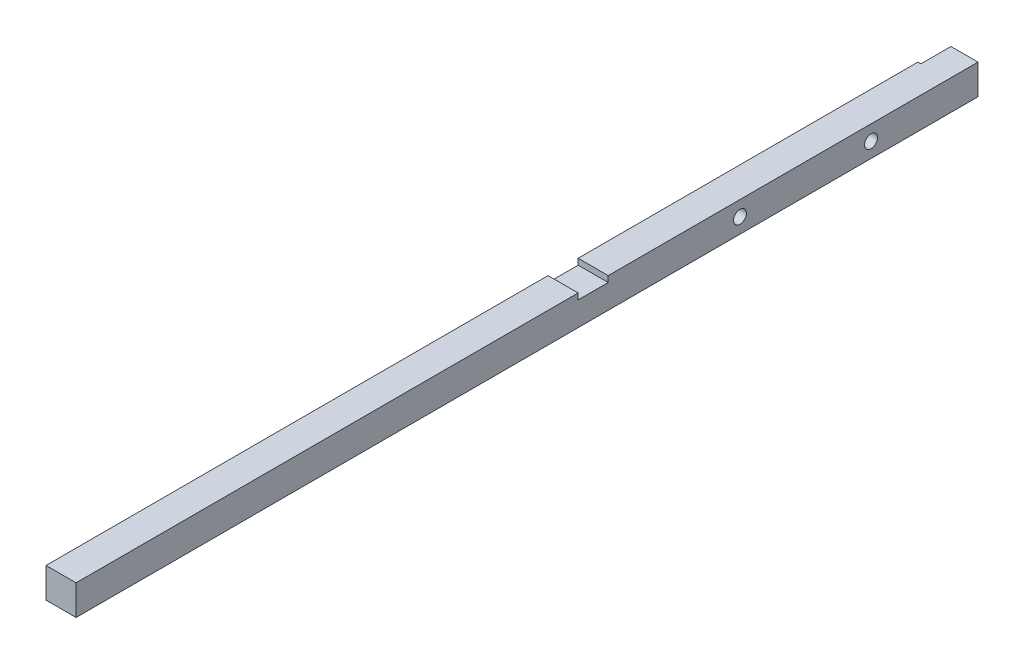
ISO-10303-21;
HEADER;
FILE_DESCRIPTION(('STEP AP214'),'2;1');
FILE_NAME('part.step','',(''),(''),'','','');
FILE_SCHEMA(('AUTOMOTIVE_DESIGN { 1 0 10303 214 1 1 1 1 }'));
ENDSEC;
DATA;
#1=APPLICATION_CONTEXT('core data for automotive mechanical design processes');
#2=APPLICATION_PROTOCOL_DEFINITION('international standard','automotive_design',2000,#1);
#3=PRODUCT_CONTEXT('',#1,'mechanical');
#4=PRODUCT('Part','Part','',(#3));
#5=PRODUCT_RELATED_PRODUCT_CATEGORY('part','',(#4));
#6=PRODUCT_DEFINITION_FORMATION('','',#4);
#7=PRODUCT_DEFINITION_CONTEXT('part definition',#1,'design');
#8=PRODUCT_DEFINITION('design','',#6,#7);
#9=PRODUCT_DEFINITION_SHAPE('','',#8);
#10=(LENGTH_UNIT() NAMED_UNIT(*) SI_UNIT(.MILLI.,.METRE.));
#11=(NAMED_UNIT(*) PLANE_ANGLE_UNIT() SI_UNIT($,.RADIAN.));
#12=(NAMED_UNIT(*) SI_UNIT($,.STERADIAN.) SOLID_ANGLE_UNIT());
#13=UNCERTAINTY_MEASURE_WITH_UNIT(LENGTH_MEASURE(1.E-05),#10,'distance_accuracy_value','');
#14=(GEOMETRIC_REPRESENTATION_CONTEXT(3) GLOBAL_UNCERTAINTY_ASSIGNED_CONTEXT((#13)) GLOBAL_UNIT_ASSIGNED_CONTEXT((#10,
#11,#12)) REPRESENTATION_CONTEXT('',''));
#15=CARTESIAN_POINT('',(0.,0.,0.));
#16=DIRECTION('',(0.,0.,1.));
#17=DIRECTION('',(1.,0.,0.));
#18=AXIS2_PLACEMENT_3D('',#15,#16,#17);
#19=CARTESIAN_POINT('',(-5.,5.,323.142135623731));
#20=DIRECTION('',(0.,-1.,0.));
#21=DIRECTION('',(0.,0.,-1.));
#22=AXIS2_PLACEMENT_3D('',#19,#20,#21);
#23=PLANE('',#22);
#24=DIRECTION('',(0.,0.,-1.));
#25=VECTOR('',#24,1.);
#26=CARTESIAN_POINT('',(5.,5.,323.142135623731));
#27=LINE('',#26,#25);
#28=CARTESIAN_POINT('',(5.,5.,307.));
#29=VERTEX_POINT('',#28);
#30=CARTESIAN_POINT('',(5.,5.,140.));
#31=VERTEX_POINT('',#30);
#32=EDGE_CURVE('E152',#29,#31,#27,.T.);
#33=ORIENTED_EDGE('',*,*,#32,.T.);
#34=DIRECTION('',(1.,0.,0.));
#35=VECTOR('',#34,1.);
#36=CARTESIAN_POINT('',(-5.,5.,140.));
#37=LINE('',#36,#35);
#38=CARTESIAN_POINT('',(-5.,5.,140.));
#39=VERTEX_POINT('',#38);
#40=EDGE_CURVE('E192',#39,#31,#37,.T.);
#41=ORIENTED_EDGE('',*,*,#40,.F.);
#42=DIRECTION('',(0.,0.,-1.));
#43=VECTOR('',#42,1.);
#44=CARTESIAN_POINT('',(-5.,5.,323.142135623731));
#45=LINE('',#44,#43);
#46=CARTESIAN_POINT('',(-5.,5.,307.));
#47=VERTEX_POINT('',#46);
#48=EDGE_CURVE('E38',#47,#39,#45,.T.);
#49=ORIENTED_EDGE('',*,*,#48,.F.);
#50=DIRECTION('',(-1.,0.,0.));
#51=VECTOR('',#50,1.);
#52=CARTESIAN_POINT('',(-5.,5.,307.));
#53=LINE('',#52,#51);
#54=EDGE_CURVE('E149',#29,#47,#53,.T.);
#55=ORIENTED_EDGE('',*,*,#54,.F.);
#56=EDGE_LOOP('',(#33,#41,#49,#55));
#57=FACE_BOUND('',#56,.T.);
#58=ADVANCED_FACE('F34',(#57),#23,.F.);
#59=CARTESIAN_POINT('',(-5.,5.,323.142135623731));
#60=DIRECTION('',(1.,0.,0.));
#61=DIRECTION('',(0.,1.,0.));
#62=AXIS2_PLACEMENT_3D('',#59,#60,#61);
#63=PLANE('',#62);
#64=CARTESIAN_POINT('',(-5.,0.,86.1864829275686));
#65=DIRECTION('',(-1.,0.,0.));
#66=DIRECTION('',(0.,0.,1.));
#67=AXIS2_PLACEMENT_3D('',#64,#65,#66);
#68=CIRCLE('',#67,2.14999999999999);
#69=CARTESIAN_POINT('',(-5.,0.,88.3364829275686));
#70=VERTEX_POINT('',#69);
#71=EDGE_CURVE('E256',#70,#70,#68,.T.);
#72=ORIENTED_EDGE('',*,*,#71,.F.);
#73=EDGE_LOOP('',(#72));
#74=FACE_BOUND('',#73,.T.);
#75=CARTESIAN_POINT('',(-5.,0.,42.5864829275686));
#76=DIRECTION('',(-1.,0.,0.));
#77=DIRECTION('',(0.,0.,1.));
#78=AXIS2_PLACEMENT_3D('',#75,#76,#77);
#79=CIRCLE('',#78,2.14999999999999);
#80=CARTESIAN_POINT('',(-5.,0.,44.7364829275686));
#81=VERTEX_POINT('',#80);
#82=EDGE_CURVE('E250',#81,#81,#79,.T.);
#83=ORIENTED_EDGE('',*,*,#82,.F.);
#84=EDGE_LOOP('',(#83));
#85=FACE_BOUND('',#84,.T.);
#86=CARTESIAN_POINT('',(-5.,5.,130.));
#87=VERTEX_POINT('',#86);
#88=CARTESIAN_POINT('',(-5.,4.99999999999999,17.));
#89=VERTEX_POINT('',#88);
#90=EDGE_CURVE('E194',#87,#89,#45,.T.);
#91=ORIENTED_EDGE('',*,*,#90,.T.);
#92=DIRECTION('',(0.,1.,0.));
#93=VECTOR('',#92,1.);
#94=CARTESIAN_POINT('',(-5.,-5.,17.));
#95=LINE('',#94,#93);
#96=CARTESIAN_POINT('',(-5.,-5.,17.));
#97=VERTEX_POINT('',#96);
#98=EDGE_CURVE('E121',#97,#89,#95,.T.);
#99=ORIENTED_EDGE('',*,*,#98,.F.);
#100=DIRECTION('',(0.,0.,-1.));
#101=VECTOR('',#100,1.);
#102=CARTESIAN_POINT('',(-5.,-5.,323.142135623731));
#103=LINE('',#102,#101);
#104=CARTESIAN_POINT('',(-5.,-5.,307.));
#105=VERTEX_POINT('',#104);
#106=EDGE_CURVE('E137',#105,#97,#103,.T.);
#107=ORIENTED_EDGE('',*,*,#106,.F.);
#108=DIRECTION('',(0.,-1.,0.));
#109=VECTOR('',#108,1.);
#110=CARTESIAN_POINT('',(-5.,5.,307.));
#111=LINE('',#110,#109);
#112=EDGE_CURVE('E146',#47,#105,#111,.T.);
#113=ORIENTED_EDGE('',*,*,#112,.F.);
#114=ORIENTED_EDGE('',*,*,#48,.T.);
#115=DIRECTION('',(0.,-1.,0.));
#116=VECTOR('',#115,1.);
#117=CARTESIAN_POINT('',(-5.,5.,140.));
#118=LINE('',#117,#116);
#119=CARTESIAN_POINT('',(-5.,3.,140.));
#120=VERTEX_POINT('',#119);
#121=EDGE_CURVE('E176',#39,#120,#118,.T.);
#122=ORIENTED_EDGE('',*,*,#121,.T.);
#123=DIRECTION('',(0.,0.,-1.));
#124=VECTOR('',#123,1.);
#125=CARTESIAN_POINT('',(-5.,3.,140.));
#126=LINE('',#125,#124);
#127=CARTESIAN_POINT('',(-5.,3.,130.));
#128=VERTEX_POINT('',#127);
#129=EDGE_CURVE('E179',#120,#128,#126,.T.);
#130=ORIENTED_EDGE('',*,*,#129,.T.);
#131=DIRECTION('',(0.,1.,0.));
#132=VECTOR('',#131,1.);
#133=CARTESIAN_POINT('',(-5.,5.,130.));
#134=LINE('',#133,#132);
#135=EDGE_CURVE('E182',#128,#87,#134,.T.);
#136=ORIENTED_EDGE('',*,*,#135,.T.);
#137=EDGE_LOOP('',(#91,#99,#107,#113,#114,#122,#130,#136));
#138=FACE_BOUND('',#137,.T.);
#139=ADVANCED_FACE('F211',(#74,#85,#138),#63,.F.);
#140=CARTESIAN_POINT('',(-5.,-5.,323.142135623731));
#141=DIRECTION('',(0.,1.,0.));
#142=DIRECTION('',(0.,0.,1.));
#143=AXIS2_PLACEMENT_3D('',#140,#141,#142);
#144=PLANE('',#143);
#145=ORIENTED_EDGE('',*,*,#106,.T.);
#146=DIRECTION('',(-1.,0.,0.));
#147=VECTOR('',#146,1.);
#148=CARTESIAN_POINT('',(-4.,-5.,17.));
#149=LINE('',#148,#147);
#150=CARTESIAN_POINT('',(-4.,-5.,17.));
#151=VERTEX_POINT('',#150);
#152=EDGE_CURVE('E129',#151,#97,#149,.T.);
#153=ORIENTED_EDGE('',*,*,#152,.F.);
#154=DIRECTION('',(0.,0.,1.));
#155=VECTOR('',#154,1.);
#156=CARTESIAN_POINT('',(-4.,-5.,7.));
#157=LINE('',#156,#155);
#158=CARTESIAN_POINT('',(-4.,-5.,7.));
#159=VERTEX_POINT('',#158);
#160=EDGE_CURVE('E115',#159,#151,#157,.T.);
#161=ORIENTED_EDGE('',*,*,#160,.F.);
#162=DIRECTION('',(1.,0.,0.));
#163=VECTOR('',#162,1.);
#164=CARTESIAN_POINT('',(-5.,-5.,7.));
#165=LINE('',#164,#163);
#166=CARTESIAN_POINT('',(5.,-5.,7.));
#167=VERTEX_POINT('',#166);
#168=EDGE_CURVE('E127',#159,#167,#165,.T.);
#169=ORIENTED_EDGE('',*,*,#168,.T.);
#170=DIRECTION('',(0.,0.,-1.));
#171=VECTOR('',#170,1.);
#172=CARTESIAN_POINT('',(5.,-5.,323.142135623731));
#173=LINE('',#172,#171);
#174=CARTESIAN_POINT('',(5.,-5.,307.));
#175=VERTEX_POINT('',#174);
#176=EDGE_CURVE('E136',#175,#167,#173,.T.);
#177=ORIENTED_EDGE('',*,*,#176,.F.);
#178=DIRECTION('',(1.,0.,0.));
#179=VECTOR('',#178,1.);
#180=CARTESIAN_POINT('',(-5.,-5.,307.));
#181=LINE('',#180,#179);
#182=EDGE_CURVE('E43',#105,#175,#181,.T.);
#183=ORIENTED_EDGE('',*,*,#182,.F.);
#184=EDGE_LOOP('',(#145,#153,#161,#169,#177,#183));
#185=FACE_BOUND('',#184,.T.);
#186=ADVANCED_FACE('F125',(#185),#144,.F.);
#187=CARTESIAN_POINT('',(5.,5.,323.142135623731));
#188=DIRECTION('',(-1.,0.,0.));
#189=DIRECTION('',(0.,-1.,0.));
#190=AXIS2_PLACEMENT_3D('',#187,#188,#189);
#191=PLANE('',#190);
#192=CARTESIAN_POINT('',(5.,0.,86.1864829275686));
#193=DIRECTION('',(-1.,0.,0.));
#194=DIRECTION('',(0.,0.,1.));
#195=AXIS2_PLACEMENT_3D('',#192,#193,#194);
#196=CIRCLE('',#195,2.15);
#197=CARTESIAN_POINT('',(5.,0.,88.3364829275686));
#198=VERTEX_POINT('',#197);
#199=EDGE_CURVE('E246',#198,#198,#196,.T.);
#200=ORIENTED_EDGE('',*,*,#199,.T.);
#201=EDGE_LOOP('',(#200));
#202=FACE_BOUND('',#201,.T.);
#203=CARTESIAN_POINT('',(5.,0.,42.5864829275686));
#204=DIRECTION('',(-1.,0.,0.));
#205=DIRECTION('',(0.,0.,1.));
#206=AXIS2_PLACEMENT_3D('',#203,#204,#205);
#207=CIRCLE('',#206,2.15);
#208=CARTESIAN_POINT('',(5.,0.,44.7364829275686));
#209=VERTEX_POINT('',#208);
#210=EDGE_CURVE('E173',#209,#209,#207,.T.);
#211=ORIENTED_EDGE('',*,*,#210,.T.);
#212=EDGE_LOOP('',(#211));
#213=FACE_BOUND('',#212,.T.);
#214=DIRECTION('',(0.,0.,-1.));
#215=VECTOR('',#214,1.);
#216=CARTESIAN_POINT('',(5.,3.,140.));
#217=LINE('',#216,#215);
#218=CARTESIAN_POINT('',(5.,3.,140.));
#219=VERTEX_POINT('',#218);
#220=CARTESIAN_POINT('',(5.,3.,130.));
#221=VERTEX_POINT('',#220);
#222=EDGE_CURVE('E188',#219,#221,#217,.T.);
#223=ORIENTED_EDGE('',*,*,#222,.F.);
#224=DIRECTION('',(0.,-1.,0.));
#225=VECTOR('',#224,1.);
#226=CARTESIAN_POINT('',(5.,5.,140.));
#227=LINE('',#226,#225);
#228=EDGE_CURVE('E174',#31,#219,#227,.T.);
#229=ORIENTED_EDGE('',*,*,#228,.F.);
#230=ORIENTED_EDGE('',*,*,#32,.F.);
#231=DIRECTION('',(0.,1.,0.));
#232=VECTOR('',#231,1.);
#233=CARTESIAN_POINT('',(5.,5.,307.));
#234=LINE('',#233,#232);
#235=EDGE_CURVE('E12',#175,#29,#234,.T.);
#236=ORIENTED_EDGE('',*,*,#235,.F.);
#237=ORIENTED_EDGE('',*,*,#176,.T.);
#238=DIRECTION('',(0.,1.,0.));
#239=VECTOR('',#238,1.);
#240=CARTESIAN_POINT('',(5.,5.,7.));
#241=LINE('',#240,#239);
#242=CARTESIAN_POINT('',(5.,5.,7.));
#243=VERTEX_POINT('',#242);
#244=EDGE_CURVE('E135',#167,#243,#241,.T.);
#245=ORIENTED_EDGE('',*,*,#244,.T.);
#246=CARTESIAN_POINT('',(5.,5.,130.));
#247=VERTEX_POINT('',#246);
#248=EDGE_CURVE('E154',#247,#243,#27,.T.);
#249=ORIENTED_EDGE('',*,*,#248,.F.);
#250=DIRECTION('',(0.,1.,0.));
#251=VECTOR('',#250,1.);
#252=CARTESIAN_POINT('',(5.,5.,130.));
#253=LINE('',#252,#251);
#254=EDGE_CURVE('E59',#221,#247,#253,.T.);
#255=ORIENTED_EDGE('',*,*,#254,.F.);
#256=EDGE_LOOP('',(#223,#229,#230,#236,#237,#245,#249,#255));
#257=FACE_BOUND('',#256,.T.);
#258=ADVANCED_FACE('F162',(#202,#213,#257),#191,.F.);
#259=DIRECTION('',(0.,0.,-1.));
#260=VECTOR('',#259,1.);
#261=CARTESIAN_POINT('',(-4.,4.99999999999999,7.));
#262=LINE('',#261,#260);
#263=CARTESIAN_POINT('',(-4.,4.99999999999999,17.));
#264=VERTEX_POINT('',#263);
#265=CARTESIAN_POINT('',(-4.,5.,7.));
#266=VERTEX_POINT('',#265);
#267=EDGE_CURVE('E51',#264,#266,#262,.T.);
#268=ORIENTED_EDGE('',*,*,#267,.F.);
#269=DIRECTION('',(-1.,0.,0.));
#270=VECTOR('',#269,1.);
#271=CARTESIAN_POINT('',(-4.,4.99999999999999,17.));
#272=LINE('',#271,#270);
#273=EDGE_CURVE('E166',#264,#89,#272,.T.);
#274=ORIENTED_EDGE('',*,*,#273,.T.);
#275=ORIENTED_EDGE('',*,*,#90,.F.);
#276=DIRECTION('',(1.,0.,0.));
#277=VECTOR('',#276,1.);
#278=CARTESIAN_POINT('',(-5.,5.,130.));
#279=LINE('',#278,#277);
#280=EDGE_CURVE('E195',#87,#247,#279,.T.);
#281=ORIENTED_EDGE('',*,*,#280,.T.);
#282=ORIENTED_EDGE('',*,*,#248,.T.);
#283=DIRECTION('',(-1.,0.,0.));
#284=VECTOR('',#283,1.);
#285=CARTESIAN_POINT('',(-5.,5.,7.));
#286=LINE('',#285,#284);
#287=EDGE_CURVE('E151',#243,#266,#286,.T.);
#288=ORIENTED_EDGE('',*,*,#287,.T.);
#289=EDGE_LOOP('',(#268,#274,#275,#281,#282,#288));
#290=FACE_BOUND('',#289,.T.);
#291=ADVANCED_FACE('F163',(#290),#23,.F.);
#292=CARTESIAN_POINT('',(0.,0.,7.));
#293=DIRECTION('',(0.,0.,1.));
#294=DIRECTION('',(1.,0.,0.));
#295=AXIS2_PLACEMENT_3D('',#292,#293,#294);
#296=PLANE('',#295);
#297=ORIENTED_EDGE('',*,*,#168,.F.);
#298=DIRECTION('',(0.,-1.,0.));
#299=VECTOR('',#298,1.);
#300=CARTESIAN_POINT('',(-4.,-5.,7.));
#301=LINE('',#300,#299);
#302=EDGE_CURVE('E112',#266,#159,#301,.T.);
#303=ORIENTED_EDGE('',*,*,#302,.F.);
#304=ORIENTED_EDGE('',*,*,#287,.F.);
#305=ORIENTED_EDGE('',*,*,#244,.F.);
#306=EDGE_LOOP('',(#297,#303,#304,#305));
#307=FACE_BOUND('',#306,.T.);
#308=ADVANCED_FACE('F133',(#307),#296,.F.);
#309=CARTESIAN_POINT('',(5.00000000000001,159.807016268671,307.));
#310=DIRECTION('',(0.,0.,1.));
#311=DIRECTION('',(0.,1.,0.));
#312=AXIS2_PLACEMENT_3D('',#309,#310,#311);
#313=PLANE('',#312);
#314=ORIENTED_EDGE('',*,*,#54,.T.);
#315=ORIENTED_EDGE('',*,*,#112,.T.);
#316=ORIENTED_EDGE('',*,*,#182,.T.);
#317=ORIENTED_EDGE('',*,*,#235,.T.);
#318=EDGE_LOOP('',(#314,#315,#316,#317));
#319=FACE_BOUND('',#318,.T.);
#320=ADVANCED_FACE('F36',(#319),#313,.T.);
#321=CARTESIAN_POINT('',(-5.,5.,140.));
#322=DIRECTION('',(0.,0.,1.));
#323=DIRECTION('',(1.,0.,0.));
#324=AXIS2_PLACEMENT_3D('',#321,#322,#323);
#325=PLANE('',#324);
#326=ORIENTED_EDGE('',*,*,#228,.T.);
#327=DIRECTION('',(1.,0.,0.));
#328=VECTOR('',#327,1.);
#329=CARTESIAN_POINT('',(-5.,3.,140.));
#330=LINE('',#329,#328);
#331=EDGE_CURVE('E185',#120,#219,#330,.T.);
#332=ORIENTED_EDGE('',*,*,#331,.F.);
#333=ORIENTED_EDGE('',*,*,#121,.F.);
#334=ORIENTED_EDGE('',*,*,#40,.T.);
#335=EDGE_LOOP('',(#326,#332,#333,#334));
#336=FACE_BOUND('',#335,.T.);
#337=ADVANCED_FACE('F204',(#336),#325,.F.);
#338=CARTESIAN_POINT('',(-5.,5.,130.));
#339=DIRECTION('',(0.,0.,-1.));
#340=DIRECTION('',(-1.,0.,0.));
#341=AXIS2_PLACEMENT_3D('',#338,#339,#340);
#342=PLANE('',#341);
#343=ORIENTED_EDGE('',*,*,#254,.T.);
#344=ORIENTED_EDGE('',*,*,#280,.F.);
#345=ORIENTED_EDGE('',*,*,#135,.F.);
#346=DIRECTION('',(1.,0.,0.));
#347=VECTOR('',#346,1.);
#348=CARTESIAN_POINT('',(-5.,3.,130.));
#349=LINE('',#348,#347);
#350=EDGE_CURVE('E197',#128,#221,#349,.T.);
#351=ORIENTED_EDGE('',*,*,#350,.T.);
#352=EDGE_LOOP('',(#343,#344,#345,#351));
#353=FACE_BOUND('',#352,.T.);
#354=ADVANCED_FACE('F222',(#353),#342,.F.);
#355=CARTESIAN_POINT('',(-5.,3.,140.));
#356=DIRECTION('',(0.,-1.,0.));
#357=DIRECTION('',(0.,0.,-1.));
#358=AXIS2_PLACEMENT_3D('',#355,#356,#357);
#359=PLANE('',#358);
#360=ORIENTED_EDGE('',*,*,#222,.T.);
#361=ORIENTED_EDGE('',*,*,#350,.F.);
#362=ORIENTED_EDGE('',*,*,#129,.F.);
#363=ORIENTED_EDGE('',*,*,#331,.T.);
#364=EDGE_LOOP('',(#360,#361,#362,#363));
#365=FACE_BOUND('',#364,.T.);
#366=ADVANCED_FACE('F201',(#365),#359,.F.);
#367=CARTESIAN_POINT('',(-4.,-5.,17.));
#368=DIRECTION('',(0.,0.,1.));
#369=DIRECTION('',(1.,0.,0.));
#370=AXIS2_PLACEMENT_3D('',#367,#368,#369);
#371=PLANE('',#370);
#372=ORIENTED_EDGE('',*,*,#98,.T.);
#373=ORIENTED_EDGE('',*,*,#273,.F.);
#374=DIRECTION('',(0.,1.,0.));
#375=VECTOR('',#374,1.);
#376=CARTESIAN_POINT('',(-4.,-5.,17.));
#377=LINE('',#376,#375);
#378=EDGE_CURVE('E130',#151,#264,#377,.T.);
#379=ORIENTED_EDGE('',*,*,#378,.F.);
#380=ORIENTED_EDGE('',*,*,#152,.T.);
#381=EDGE_LOOP('',(#372,#373,#379,#380));
#382=FACE_BOUND('',#381,.T.);
#383=ADVANCED_FACE('F213',(#382),#371,.F.);
#384=CARTESIAN_POINT('',(-4.,0.,0.));
#385=DIRECTION('',(1.,0.,0.));
#386=DIRECTION('',(0.,0.,-1.));
#387=AXIS2_PLACEMENT_3D('',#384,#385,#386);
#388=PLANE('',#387);
#389=ORIENTED_EDGE('',*,*,#302,.T.);
#390=ORIENTED_EDGE('',*,*,#160,.T.);
#391=ORIENTED_EDGE('',*,*,#378,.T.);
#392=ORIENTED_EDGE('',*,*,#267,.T.);
#393=EDGE_LOOP('',(#389,#390,#391,#392));
#394=FACE_BOUND('',#393,.T.);
#395=ADVANCED_FACE('F114',(#394),#388,.F.);
#396=CARTESIAN_POINT('',(-5.,0.,42.5864829275686));
#397=DIRECTION('',(-1.,0.,0.));
#398=DIRECTION('',(0.,0.,1.));
#399=AXIS2_PLACEMENT_3D('',#396,#397,#398);
#400=CYLINDRICAL_SURFACE('',#399,2.14999999999999);
#401=ORIENTED_EDGE('',*,*,#210,.F.);
#402=EDGE_LOOP('',(#401));
#403=FACE_BOUND('',#402,.T.);
#404=ORIENTED_EDGE('',*,*,#82,.T.);
#405=EDGE_LOOP('',(#404));
#406=FACE_BOUND('',#405,.T.);
#407=ADVANCED_FACE('F220',(#403,#406),#400,.F.);
#408=CARTESIAN_POINT('',(-5.,0.,86.1864829275686));
#409=DIRECTION('',(-1.,0.,0.));
#410=DIRECTION('',(0.,0.,1.));
#411=AXIS2_PLACEMENT_3D('',#408,#409,#410);
#412=CYLINDRICAL_SURFACE('',#411,2.14999999999999);
#413=ORIENTED_EDGE('',*,*,#199,.F.);
#414=EDGE_LOOP('',(#413));
#415=FACE_BOUND('',#414,.T.);
#416=ORIENTED_EDGE('',*,*,#71,.T.);
#417=EDGE_LOOP('',(#416));
#418=FACE_BOUND('',#417,.T.);
#419=ADVANCED_FACE('F260',(#415,#418),#412,.F.);
#420=CLOSED_SHELL('',(#58,#139,#186,#258,#291,#308,#320,#337,#354,#366,#383,#395,#407,#419));
#421=MANIFOLD_SOLID_BREP('B2',#420);
#422=ADVANCED_BREP_SHAPE_REPRESENTATION('',(#18,#421),#14);
#423=SHAPE_DEFINITION_REPRESENTATION(#9,#422);
ENDSEC;
END-ISO-10303-21;
